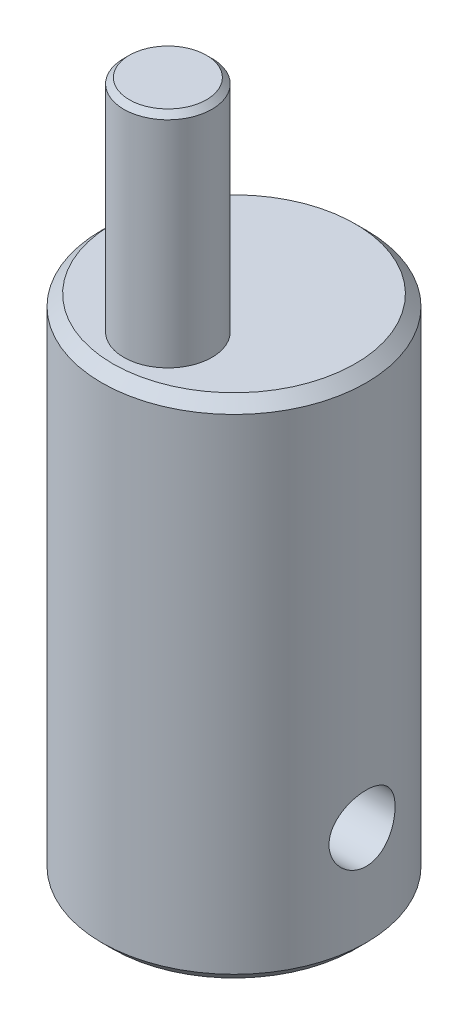
ISO-10303-21;
HEADER;
FILE_DESCRIPTION(('STEP AP214'),'2;1');
FILE_NAME('part.step','',(''),(''),'','','');
FILE_SCHEMA(('AUTOMOTIVE_DESIGN { 1 0 10303 214 1 1 1 1 }'));
ENDSEC;
DATA;
#1=APPLICATION_CONTEXT('core data for automotive mechanical design processes');
#2=APPLICATION_PROTOCOL_DEFINITION('international standard','automotive_design',2000,#1);
#3=PRODUCT_CONTEXT('',#1,'mechanical');
#4=PRODUCT('Part','Part','',(#3));
#5=PRODUCT_RELATED_PRODUCT_CATEGORY('part','',(#4));
#6=PRODUCT_DEFINITION_FORMATION('','',#4);
#7=PRODUCT_DEFINITION_CONTEXT('part definition',#1,'design');
#8=PRODUCT_DEFINITION('design','',#6,#7);
#9=PRODUCT_DEFINITION_SHAPE('','',#8);
#10=(LENGTH_UNIT() NAMED_UNIT(*) SI_UNIT(.MILLI.,.METRE.));
#11=(NAMED_UNIT(*) PLANE_ANGLE_UNIT() SI_UNIT($,.RADIAN.));
#12=(NAMED_UNIT(*) SI_UNIT($,.STERADIAN.) SOLID_ANGLE_UNIT());
#13=UNCERTAINTY_MEASURE_WITH_UNIT(LENGTH_MEASURE(1.E-05),#10,'distance_accuracy_value','');
#14=(GEOMETRIC_REPRESENTATION_CONTEXT(3) GLOBAL_UNCERTAINTY_ASSIGNED_CONTEXT((#13)) GLOBAL_UNIT_ASSIGNED_CONTEXT((#10,
#11,#12)) REPRESENTATION_CONTEXT('',''));
#15=CARTESIAN_POINT('',(0.,0.,0.));
#16=DIRECTION('',(0.,0.,1.));
#17=DIRECTION('',(1.,0.,0.));
#18=AXIS2_PLACEMENT_3D('',#15,#16,#17);
#19=CARTESIAN_POINT('',(0.,23.,0.));
#20=DIRECTION('',(0.,-1.,0.));
#21=DIRECTION('',(0.,0.,-1.));
#22=AXIS2_PLACEMENT_3D('',#19,#20,#21);
#23=CYLINDRICAL_SURFACE('',#22,6.);
#24=CARTESIAN_POINT('',(0.,0.499999999999994,0.));
#25=DIRECTION('',(0.,1.,0.));
#26=DIRECTION('',(0.,0.,1.));
#27=AXIS2_PLACEMENT_3D('',#24,#25,#26);
#28=CIRCLE('',#27,6.);
#29=CARTESIAN_POINT('',(0.,0.499999999999994,6.));
#30=VERTEX_POINT('',#29);
#31=EDGE_CURVE('E57',#30,#30,#28,.T.);
#32=ORIENTED_EDGE('',*,*,#31,.T.);
#33=EDGE_LOOP('',(#32));
#34=FACE_BOUND('',#33,.T.);
#35=CARTESIAN_POINT('',(0.,22.5,0.));
#36=DIRECTION('',(0.,1.,0.));
#37=DIRECTION('',(0.,0.,1.));
#38=AXIS2_PLACEMENT_3D('',#35,#36,#37);
#39=CIRCLE('',#38,6.);
#40=CARTESIAN_POINT('',(0.,22.5,6.));
#41=VERTEX_POINT('',#40);
#42=EDGE_CURVE('E62',#41,#41,#39,.F.);
#43=ORIENTED_EDGE('',*,*,#42,.T.);
#44=EDGE_LOOP('',(#43));
#45=FACE_BOUND('',#44,.T.);
#46=CARTESIAN_POINT('',(-6.,3.5,0.));
#47=CARTESIAN_POINT('',(-5.99999859868013,3.50000232573816,-0.0828760886697311));
#48=CARTESIAN_POINT('',(-5.99826578131828,3.50689155077379,-0.165778157830763));
#49=CARTESIAN_POINT('',(-5.99152113829892,3.534225151307,-0.329206323770533));
#50=CARTESIAN_POINT('',(-5.98650745419968,3.55467720953785,-0.409731046870739));
#51=CARTESIAN_POINT('',(-5.9737562633204,3.60843925346209,-0.566020872182577));
#52=CARTESIAN_POINT('',(-5.96602202842087,3.64173379871528,-0.641791563430003));
#53=CARTESIAN_POINT('',(-5.94865343807593,3.72018139004483,-0.786672131904427));
#54=CARTESIAN_POINT('',(-5.9390190185405,3.76533483611894,-0.855781784348759));
#55=CARTESIAN_POINT('',(-5.91867413591801,3.86720078965421,-0.98680192730092));
#56=CARTESIAN_POINT('',(-5.90794707148533,3.92411157495918,-1.04855569006107));
#57=CARTESIAN_POINT('',(-5.88673620117529,4.04745220490892,-1.1617489272033));
#58=CARTESIAN_POINT('',(-5.87625242288348,4.1138831229465,-1.21318723694913));
#59=CARTESIAN_POINT('',(-5.8565477569971,4.25559522673744,-1.30502654279903));
#60=CARTESIAN_POINT('',(-5.84734794470605,4.3309932308104,-1.34525221592536));
#61=CARTESIAN_POINT('',(-5.83149494812223,4.48774841165836,-1.41239690855053));
#62=CARTESIAN_POINT('',(-5.82484135672789,4.56910463332576,-1.43931805543933));
#63=CARTESIAN_POINT('',(-5.81500476717551,4.73374349820247,-1.47855483680429));
#64=CARTESIAN_POINT('',(-5.81175491075426,4.8169548960498,-1.49115226833334));
#65=CARTESIAN_POINT('',(-5.80889362537741,4.98436856901398,-1.50226177506785));
#66=CARTESIAN_POINT('',(-5.80928160448644,5.06857068069861,-1.50077614181798));
#67=CARTESIAN_POINT('',(-5.81359205496618,5.23341580774448,-1.48398652463928));
#68=CARTESIAN_POINT('',(-5.81742863001879,5.3140956214651,-1.46901834019052));
#69=CARTESIAN_POINT('',(-5.82806709676483,5.47176105091129,-1.42622418690311));
#70=CARTESIAN_POINT('',(-5.83486919970696,5.54874640302898,-1.39839730206942));
#71=CARTESIAN_POINT('',(-5.85075113904186,5.69773801625207,-1.33038947793715));
#72=CARTESIAN_POINT('',(-5.85985327469421,5.76968617178955,-1.29008666723291));
#73=CARTESIAN_POINT('',(-5.87929710846386,5.90591870975684,-1.19835627601495));
#74=CARTESIAN_POINT('',(-5.88963902334735,5.97020174806726,-1.14692674880884));
#75=CARTESIAN_POINT('',(-5.91075880539781,6.0912036156944,-1.03266342468122));
#76=CARTESIAN_POINT('',(-5.92154069477971,6.14765449006135,-0.96954625816586));
#77=CARTESIAN_POINT('',(-5.94205965578786,6.2492212424639,-0.8346119175037));
#78=CARTESIAN_POINT('',(-5.95179669549415,6.29433677426357,-0.762794477707944));
#79=CARTESIAN_POINT('',(-5.96917732094182,6.37205058622439,-0.612115888681392));
#80=CARTESIAN_POINT('',(-5.97681360127725,6.40460534025443,-0.533231393208624));
#81=CARTESIAN_POINT('',(-5.98907916991418,6.45591730570957,-0.370876008142883));
#82=CARTESIAN_POINT('',(-5.99370903339281,6.47467715641814,-0.287405999150485));
#83=CARTESIAN_POINT('',(-5.99935499271374,6.49745756555884,-0.120539970390027));
#84=CARTESIAN_POINT('',(-6.00046053508279,6.5018430260753,-0.0371967199882104));
#85=CARTESIAN_POINT('',(-5.99918804814451,6.49675099794451,0.129032874801507));
#86=CARTESIAN_POINT('',(-5.99681033241846,6.48727475720087,0.211919259644594));
#87=CARTESIAN_POINT('',(-5.98889581127357,6.45502909160862,0.373614268776491));
#88=CARTESIAN_POINT('',(-5.98340634185811,6.43245873652301,0.452465118968754));
#89=CARTESIAN_POINT('',(-5.96988706634134,6.37489291597155,0.605257292452511));
#90=CARTESIAN_POINT('',(-5.96185700369892,6.33989619568683,0.679198119032634));
#91=CARTESIAN_POINT('',(-5.9439330792631,6.25776387112527,0.821523134429847));
#92=CARTESIAN_POINT('',(-5.93400867366932,6.21042388760324,0.88978544183583));
#93=CARTESIAN_POINT('',(-5.91344509187419,6.10521009120303,1.01752661364325));
#94=CARTESIAN_POINT('',(-5.90280579251705,6.04733446038309,1.07700395897301));
#95=CARTESIAN_POINT('',(-5.88168956960771,5.92099803915554,1.18699056807273));
#96=CARTESIAN_POINT('',(-5.87122304187281,5.85231229699758,1.23724386762203));
#97=CARTESIAN_POINT('',(-5.85192878377239,5.70726736553428,1.3255107590127));
#98=CARTESIAN_POINT('',(-5.84310098067026,5.63090851704025,1.36352489415794));
#99=CARTESIAN_POINT('',(-5.82818094734665,5.47309427758692,1.42595142060929));
#100=CARTESIAN_POINT('',(-5.82207255291905,5.39167237165599,1.45044439665406));
#101=CARTESIAN_POINT('',(-5.81326744090183,5.22569036211089,1.48534565995378));
#102=CARTESIAN_POINT('',(-5.81056997719936,5.14113094896751,1.49575702747866));
#103=CARTESIAN_POINT('',(-5.80894901203957,4.9738789761448,1.50203859033399));
#104=CARTESIAN_POINT('',(-5.80991932728264,4.89120256487527,1.49831789778012));
#105=CARTESIAN_POINT('',(-5.81527909007843,4.72769611133202,1.47737727831287));
#106=CARTESIAN_POINT('',(-5.81966846891857,4.64686603198635,1.46015762268677));
#107=CARTESIAN_POINT('',(-5.83131260682722,4.48979154093459,1.41293131944279));
#108=CARTESIAN_POINT('',(-5.83855015236309,4.41352269475979,1.38300140468038));
#109=CARTESIAN_POINT('',(-5.85507755724828,4.26703461728631,1.31126491360507));
#110=CARTESIAN_POINT('',(-5.86436770120773,4.19681622681309,1.26945669003419));
#111=CARTESIAN_POINT('',(-5.88425634263512,4.06244537099798,1.17386774863714));
#112=CARTESIAN_POINT('',(-5.89488264831757,3.99849892657604,1.11980316291226));
#113=CARTESIAN_POINT('',(-5.91608027246286,3.88045295520459,1.00178937118974));
#114=CARTESIAN_POINT('',(-5.92665157727059,3.82635576988703,0.937837821261146));
#115=CARTESIAN_POINT('',(-5.94677655647663,3.72858869143539,0.800467586702591));
#116=CARTESIAN_POINT('',(-5.95630833365868,3.68512538632842,0.726898422316388));
#117=CARTESIAN_POINT('',(-5.97304924975118,3.61125253705947,0.573266059510477));
#118=CARTESIAN_POINT('',(-5.98026005199781,3.58083363935146,0.49320756343674));
#119=CARTESIAN_POINT('',(-5.99048059565541,3.53842816967035,0.344410253243472));
#120=CARTESIAN_POINT('',(-5.9940258505269,3.52404875694657,0.276380170908069));
#121=CARTESIAN_POINT('',(-5.99878605231948,3.50483405637806,0.138906071536283));
#122=CARTESIAN_POINT('',(-6.00000117450894,3.4999980506947,0.0694621612426164));
#123=CARTESIAN_POINT('',(-6.,3.5,0.));
#124=B_SPLINE_CURVE_WITH_KNOTS('',3,(#46,#47,#48,#49,#50,#51,#52,#53,#54,#55,#56,#57,#58,#59,
#60,#61,#62,#63,#64,#65,#66,#67,#68,#69,#70,#71,#72,#73,#74,#75,#76,#77,#78,#79,#80,#81,#82,#83,
#84,#85,#86,#87,#88,#89,#90,#91,#92,#93,#94,#95,#96,#97,#98,#99,#100,#101,#102,#103,#104,#105,
#106,#107,#108,#109,#110,#111,#112,#113,#114,#115,#116,#117,#118,#119,#120,#121,#122,#123),
.UNSPECIFIED.,.T.,.F.,(4,2,2,2,2,2,2,2,2,2,2,2,2,2,2,2,2,2,2,2,2,2,2,2,2,2,2,2,2,2,2,2,2,2,2,2,
2,2,4),(0.,0.24837371247189,0.4968882377639,0.745104902286106,0.993329940169329,
1.24614435437139,1.49898729580062,1.75558647545807,2.01214461169368,2.2635629509943,
2.51494038112697,2.76022497007018,3.00552703466038,3.25330527873879,3.50112690836163,
3.75601500969019,4.01091089558247,4.26668229009114,4.52240473688643,4.77158308949276,
5.02073901112743,5.26620274514037,5.5116912732229,5.76153587565352,6.01142363008019,
6.26744509204476,6.52345518749508,6.77792254614036,7.03233423252407,7.27943780398612,
7.52653640956034,7.77216400559447,8.01782568136901,8.2698957640991,8.52202569770417,
8.77872185499588,9.0352336382135,9.24342242942149,9.45159556043039),.UNSPECIFIED.);
#125=CARTESIAN_POINT('',(-6.,3.5,0.));
#126=VERTEX_POINT('',#125);
#127=EDGE_CURVE('E76',#126,#126,#124,.T.);
#128=ORIENTED_EDGE('',*,*,#127,.T.);
#129=EDGE_LOOP('',(#128));
#130=FACE_BOUND('',#129,.T.);
#131=CARTESIAN_POINT('',(5.80947501931112,5.,-1.5));
#132=CARTESIAN_POINT('',(5.80947660051185,4.91716954944523,-1.49999764715507));
#133=CARTESIAN_POINT('',(5.81126583608348,4.8343130607932,-1.49311574729838));
#134=CARTESIAN_POINT('',(5.81821117195949,4.67097945309558,-1.46581387527848));
#135=CARTESIAN_POINT('',(5.82336923173088,4.590503747319,-1.44538602404532));
#136=CARTESIAN_POINT('',(5.8364323475758,4.43431787708778,-1.39169471977917));
#137=CARTESIAN_POINT('',(5.84433385614245,4.3586017067686,-1.35844783671268));
#138=CARTESIAN_POINT('',(5.86198915217285,4.21381348847605,-1.28011268475685));
#139=CARTESIAN_POINT('',(5.87174301827101,4.14474172275186,-1.23502391313642));
#140=CARTESIAN_POINT('',(5.89224429813367,4.01368301284268,-1.13322505638712));
#141=CARTESIAN_POINT('',(5.90300758573818,3.95186383978997,-1.07630213262243));
#142=CARTESIAN_POINT('',(5.92417725309178,3.83854316338379,-0.952909238460398));
#143=CARTESIAN_POINT('',(5.93458359939834,3.78704262462695,-0.886438376508184));
#144=CARTESIAN_POINT('',(5.95404249312349,3.69513471942123,-0.744687120647372));
#145=CARTESIAN_POINT('',(5.96307412440355,3.65489216710312,-0.669296745717072));
#146=CARTESIAN_POINT('',(5.9785848715559,3.58771421350815,-0.512557910575657));
#147=CARTESIAN_POINT('',(5.98506436400607,3.56077684885069,-0.431210331475164));
#148=CARTESIAN_POINT('',(5.99462855308908,3.52151129925285,-0.266615255252496));
#149=CARTESIAN_POINT('',(5.99777936306588,3.50889821340405,-0.183439631729385));
#150=CARTESIAN_POINT('',(6.00056156464379,3.49774497243467,-0.016097291557661));
#151=CARTESIAN_POINT('',(6.00019347658022,3.49920273667424,0.0680692767228418));
#152=CARTESIAN_POINT('',(5.99602856972121,3.51594491015009,0.233028370758582));
#153=CARTESIAN_POINT('',(5.99230801404524,3.53092179503231,0.313854323401601));
#154=CARTESIAN_POINT('',(5.98194501914912,3.5737827620291,0.47180737112053));
#155=CARTESIAN_POINT('',(5.97530242439064,3.60166753122645,0.548934269055657));
#156=CARTESIAN_POINT('',(5.95972505820537,3.66980154241224,0.698110055252711));
#157=CARTESIAN_POINT('',(5.95077011817032,3.71016022679705,0.770106764649757));
#158=CARTESIAN_POINT('',(5.93153942285789,3.80201340746976,0.906413433510734));
#159=CARTESIAN_POINT('',(5.92126343791494,3.85350984113637,0.970722052628259));
#160=CARTESIAN_POINT('',(5.90018228261712,3.96782524518943,1.09166105262743));
#161=CARTESIAN_POINT('',(5.88937031715551,4.03091293540867,1.1480365186128));
#162=CARTESIAN_POINT('',(5.86869026110024,4.16575998412415,1.24946456394453));
#163=CARTESIAN_POINT('',(5.85882221463582,4.2375197476946,1.29451661406903));
#164=CARTESIAN_POINT('',(5.84112298098989,4.38817402048938,1.3721821935339));
#165=CARTESIAN_POINT('',(5.83330190235432,4.46710143818792,1.40473435045574));
#166=CARTESIAN_POINT('',(5.82071184083974,4.62955128084587,1.45602843095451));
#167=CARTESIAN_POINT('',(5.81594220486131,4.71307271838988,1.47477330982937));
#168=CARTESIAN_POINT('',(5.81013213623484,4.87997570091387,1.49749778319911));
#169=CARTESIAN_POINT('',(5.80899653456189,4.96330267599778,1.50185428435178));
#170=CARTESIAN_POINT('',(5.81032406088624,5.1294931619469,1.49671019430933));
#171=CARTESIAN_POINT('',(5.8127868576076,5.21235671477075,1.48721087870928));
#172=CARTESIAN_POINT('',(5.82094249172736,5.37386855897283,1.4549552783626));
#173=CARTESIAN_POINT('',(5.82658182140625,5.45256363594251,1.43241844096905));
#174=CARTESIAN_POINT('',(5.84040430962577,5.60505887471101,1.37497084900237));
#175=CARTESIAN_POINT('',(5.84858776949168,5.6788584554332,1.34005862862753));
#176=CARTESIAN_POINT('',(5.86677682255957,5.82106476672041,1.25806240076193));
#177=CARTESIAN_POINT('',(5.87681501163985,5.88933730402586,1.21075305230138));
#178=CARTESIAN_POINT('',(5.89750249843029,6.01711301768081,1.10559043940168));
#179=CARTESIAN_POINT('',(5.90815189637082,6.07661474999005,1.04773544220816));
#180=CARTESIAN_POINT('',(5.92918441818964,6.18668662554257,0.921394081477088));
#181=CARTESIAN_POINT('',(5.93955421237101,6.23699603752929,0.852677928797388));
#182=CARTESIAN_POINT('',(5.9585832996824,6.32536152017075,0.707554024042012));
#183=CARTESIAN_POINT('',(5.96724268202376,6.36341822996492,0.631146673436386));
#184=CARTESIAN_POINT('',(5.98182069442988,6.42586762071676,0.473337302596635));
#185=CARTESIAN_POINT('',(5.98775898013446,6.45035857062744,0.391976071541821));
#186=CARTESIAN_POINT('',(5.99631176037473,6.48527620076505,0.226124640478211));
#187=CARTESIAN_POINT('',(5.99892689636045,6.49570559524343,0.141635047561864));
#188=CARTESIAN_POINT('',(6.00051254113217,6.5020513843633,-0.0256252896649907));
#189=CARTESIAN_POINT('',(5.99957968320012,6.49835256364309,-0.108380740449051));
#190=CARTESIAN_POINT('',(5.99438844686135,6.4774282590585,-0.27205124462211));
#191=CARTESIAN_POINT('',(5.99013016735643,6.46020317748035,-0.352966352671331));
#192=CARTESIAN_POINT('',(5.97878149280944,6.41292167034361,-0.510256553467225));
#193=CARTESIAN_POINT('',(5.97170646753999,6.38293482002806,-0.586653741871529));
#194=CARTESIAN_POINT('',(5.95546933370076,6.31104413147101,-0.733375579562203));
#195=CARTESIAN_POINT('',(5.94630696206604,6.26913879099565,-0.803699461897578));
#196=CARTESIAN_POINT('',(5.92660874521999,6.17342714900439,-0.93810289263585));
#197=CARTESIAN_POINT('',(5.91604525418417,6.11935978563893,-1.00199248245088));
#198=CARTESIAN_POINT('',(5.89485973579863,6.0013657220393,-1.11992253040688));
#199=CARTESIAN_POINT('',(5.88423769428834,5.93743652585314,-1.17396048760228));
#200=CARTESIAN_POINT('',(5.86391213790822,5.800097878698,-1.27164303971884));
#201=CARTESIAN_POINT('',(5.85422945594827,5.72653381488106,-1.31507492916982));
#202=CARTESIAN_POINT('',(5.83715933325923,5.57291676511595,-1.3888903449235));
#203=CARTESIAN_POINT('',(5.82977022370054,5.49286855083989,-1.41928336463958));
#204=CARTESIAN_POINT('',(5.81927863109675,5.34413448225992,-1.46163379284816));
#205=CARTESIAN_POINT('',(5.8156299450082,5.27616025342421,-1.47598975589307));
#206=CARTESIAN_POINT('',(5.81072757878358,5.13879669650005,-1.4951734388599));
#207=CARTESIAN_POINT('',(5.80947369434945,5.06940748963241,-1.50000197155828));
#208=CARTESIAN_POINT('',(5.80947501931112,5.,-1.5));
#209=B_SPLINE_CURVE_WITH_KNOTS('',3,(#131,#132,#133,#134,#135,#136,#137,#138,#139,#140,#141,
#142,#143,#144,#145,#146,#147,#148,#149,#150,#151,#152,#153,#154,#155,#156,#157,#158,#159,#160,
#161,#162,#163,#164,#165,#166,#167,#168,#169,#170,#171,#172,#173,#174,#175,#176,#177,#178,#179,
#180,#181,#182,#183,#184,#185,#186,#187,#188,#189,#190,#191,#192,#193,#194,#195,#196,#197,#198,
#199,#200,#201,#202,#203,#204,#205,#206,#207,#208),.UNSPECIFIED.,.T.,.F.,(4,2,2,2,2,2,2,2,2,2,2,
2,2,2,2,2,2,2,2,2,2,2,2,2,2,2,2,2,2,2,2,2,2,2,2,2,2,2,4),(0.,0.248236465041681,0.4966174448572,
0.744678436299613,0.992749960532871,1.24574372515786,1.4987611288792,1.75530897838752,
2.01181895908255,2.26313250597208,2.51440889199612,2.76010957613368,3.00582334034872,
3.25375724552667,3.50173431281348,3.75642279943147,4.01112318719881,4.26705859205042,
4.52293920077729,4.7720614485703,5.02116076310281,5.26618443005524,5.51123712852851,
5.76109707515495,6.01099811331027,6.26715198579191,6.52329249431732,6.77755243684158,
7.03176329345423,7.27910067676474,7.52643070426189,7.77242925935826,8.01845883442843,
8.27038257949243,8.52237018939305,8.77905886370806,9.03556032819972,9.24358696306398,
9.45159585059712),.UNSPECIFIED.);
#210=CARTESIAN_POINT('',(5.80947501931112,5.,-1.5));
#211=VERTEX_POINT('',#210);
#212=EDGE_CURVE('E85',#211,#211,#209,.T.);
#213=ORIENTED_EDGE('',*,*,#212,.T.);
#214=EDGE_LOOP('',(#213));
#215=FACE_BOUND('',#214,.T.);
#216=ADVANCED_FACE('F43',(#34,#45,#130,#215),#23,.T.);
#217=CARTESIAN_POINT('',(0.,23.,0.));
#218=DIRECTION('',(0.,1.,0.));
#219=DIRECTION('',(0.,0.,1.));
#220=AXIS2_PLACEMENT_3D('',#217,#218,#219);
#221=PLANE('',#220);
#222=CARTESIAN_POINT('',(0.,23.,0.));
#223=DIRECTION('',(0.,1.,0.));
#224=DIRECTION('',(0.,0.,1.));
#225=AXIS2_PLACEMENT_3D('',#222,#223,#224);
#226=CIRCLE('',#225,5.50000000000001);
#227=CARTESIAN_POINT('',(0.,23.,5.50000000000001));
#228=VERTEX_POINT('',#227);
#229=EDGE_CURVE('E10',#228,#228,#226,.T.);
#230=ORIENTED_EDGE('',*,*,#229,.T.);
#231=EDGE_LOOP('',(#230));
#232=FACE_BOUND('',#231,.T.);
#233=CARTESIAN_POINT('',(0.,23.,3.));
#234=DIRECTION('',(0.,1.,0.));
#235=DIRECTION('',(0.,0.,1.));
#236=AXIS2_PLACEMENT_3D('',#233,#234,#235);
#237=CIRCLE('',#236,2.);
#238=CARTESIAN_POINT('',(0.,23.,5.));
#239=VERTEX_POINT('',#238);
#240=EDGE_CURVE('E127',#239,#239,#237,.T.);
#241=ORIENTED_EDGE('',*,*,#240,.F.);
#242=EDGE_LOOP('',(#241));
#243=FACE_BOUND('',#242,.T.);
#244=ADVANCED_FACE('F109',(#232,#243),#221,.T.);
#245=CARTESIAN_POINT('',(0.,0.,0.));
#246=DIRECTION('',(0.,1.,0.));
#247=DIRECTION('',(0.,0.,1.));
#248=AXIS2_PLACEMENT_3D('',#245,#246,#247);
#249=PLANE('',#248);
#250=CARTESIAN_POINT('',(0.,0.,0.));
#251=DIRECTION('',(0.,1.,0.));
#252=DIRECTION('',(0.,0.,1.));
#253=AXIS2_PLACEMENT_3D('',#250,#251,#252);
#254=CIRCLE('',#253,5.5);
#255=CARTESIAN_POINT('',(0.,0.,5.5));
#256=VERTEX_POINT('',#255);
#257=EDGE_CURVE('E52',#256,#256,#254,.F.);
#258=ORIENTED_EDGE('',*,*,#257,.T.);
#259=EDGE_LOOP('',(#258));
#260=FACE_BOUND('',#259,.T.);
#261=ADVANCED_FACE('F107',(#260),#249,.F.);
#262=CARTESIAN_POINT('',(0.,33.,3.));
#263=DIRECTION('',(0.,-1.,0.));
#264=DIRECTION('',(0.,0.,-1.));
#265=AXIS2_PLACEMENT_3D('',#262,#263,#264);
#266=CYLINDRICAL_SURFACE('',#265,2.);
#267=CARTESIAN_POINT('',(0.,32.75,3.));
#268=DIRECTION('',(0.,1.,0.));
#269=DIRECTION('',(0.,0.,1.));
#270=AXIS2_PLACEMENT_3D('',#267,#268,#269);
#271=CIRCLE('',#270,2.);
#272=CARTESIAN_POINT('',(0.,32.75,5.));
#273=VERTEX_POINT('',#272);
#274=EDGE_CURVE('E68',#273,#273,#271,.F.);
#275=ORIENTED_EDGE('',*,*,#274,.T.);
#276=EDGE_LOOP('',(#275));
#277=FACE_BOUND('',#276,.T.);
#278=ORIENTED_EDGE('',*,*,#240,.T.);
#279=EDGE_LOOP('',(#278));
#280=FACE_BOUND('',#279,.T.);
#281=ADVANCED_FACE('F103',(#277,#280),#266,.T.);
#282=CARTESIAN_POINT('',(0.,33.,3.));
#283=DIRECTION('',(0.,1.,0.));
#284=DIRECTION('',(0.,0.,1.));
#285=AXIS2_PLACEMENT_3D('',#282,#283,#284);
#286=PLANE('',#285);
#287=CARTESIAN_POINT('',(0.,33.,3.));
#288=DIRECTION('',(0.,1.,0.));
#289=DIRECTION('',(0.,0.,1.));
#290=AXIS2_PLACEMENT_3D('',#287,#288,#289);
#291=CIRCLE('',#290,1.75000000000001);
#292=CARTESIAN_POINT('',(0.,33.,4.75000000000001));
#293=VERTEX_POINT('',#292);
#294=EDGE_CURVE('E72',#293,#293,#291,.T.);
#295=ORIENTED_EDGE('',*,*,#294,.T.);
#296=EDGE_LOOP('',(#295));
#297=FACE_BOUND('',#296,.T.);
#298=ADVANCED_FACE('F98',(#297),#286,.T.);
#299=CARTESIAN_POINT('',(-6.,5.,0.));
#300=DIRECTION('',(1.,0.,0.));
#301=DIRECTION('',(0.,0.,-1.));
#302=AXIS2_PLACEMENT_3D('',#299,#300,#301);
#303=CYLINDRICAL_SURFACE('',#302,1.5);
#304=ORIENTED_EDGE('',*,*,#212,.F.);
#305=EDGE_LOOP('',(#304));
#306=FACE_BOUND('',#305,.T.);
#307=ORIENTED_EDGE('',*,*,#127,.F.);
#308=EDGE_LOOP('',(#307));
#309=FACE_BOUND('',#308,.T.);
#310=ADVANCED_FACE('F93',(#306,#309),#303,.F.);
#311=CARTESIAN_POINT('',(0.,33.,3.));
#312=DIRECTION('',(0.,-1.,0.));
#313=DIRECTION('',(0.,0.,-1.));
#314=AXIS2_PLACEMENT_3D('',#311,#312,#313);
#315=CONICAL_SURFACE('',#314,1.75000000000001,0.785398163397438);
#316=ORIENTED_EDGE('',*,*,#274,.F.);
#317=EDGE_LOOP('',(#316));
#318=FACE_BOUND('',#317,.T.);
#319=ORIENTED_EDGE('',*,*,#294,.F.);
#320=EDGE_LOOP('',(#319));
#321=FACE_BOUND('',#320,.T.);
#322=ADVANCED_FACE('F97',(#318,#321),#315,.T.);
#323=CARTESIAN_POINT('',(0.,0.499999999999994,0.));
#324=DIRECTION('',(0.,1.,0.));
#325=DIRECTION('',(0.,0.,1.));
#326=AXIS2_PLACEMENT_3D('',#323,#324,#325);
#327=CONICAL_SURFACE('',#326,6.,0.785398163397453);
#328=ORIENTED_EDGE('',*,*,#257,.F.);
#329=EDGE_LOOP('',(#328));
#330=FACE_BOUND('',#329,.T.);
#331=ORIENTED_EDGE('',*,*,#31,.F.);
#332=EDGE_LOOP('',(#331));
#333=FACE_BOUND('',#332,.T.);
#334=ADVANCED_FACE('F137',(#330,#333),#327,.T.);
#335=CARTESIAN_POINT('',(0.,23.,0.));
#336=DIRECTION('',(0.,-1.,0.));
#337=DIRECTION('',(0.,0.,-1.));
#338=AXIS2_PLACEMENT_3D('',#335,#336,#337);
#339=CONICAL_SURFACE('',#338,5.50000000000001,0.785398163397446);
#340=ORIENTED_EDGE('',*,*,#42,.F.);
#341=EDGE_LOOP('',(#340));
#342=FACE_BOUND('',#341,.T.);
#343=ORIENTED_EDGE('',*,*,#229,.F.);
#344=EDGE_LOOP('',(#343));
#345=FACE_BOUND('',#344,.T.);
#346=ADVANCED_FACE('F46',(#342,#345),#339,.T.);
#347=CLOSED_SHELL('',(#216,#244,#261,#281,#298,#310,#322,#334,#346));
#348=MANIFOLD_SOLID_BREP('B2',#347);
#349=ADVANCED_BREP_SHAPE_REPRESENTATION('',(#18,#348),#14);
#350=SHAPE_DEFINITION_REPRESENTATION(#9,#349);
ENDSEC;
END-ISO-10303-21;
